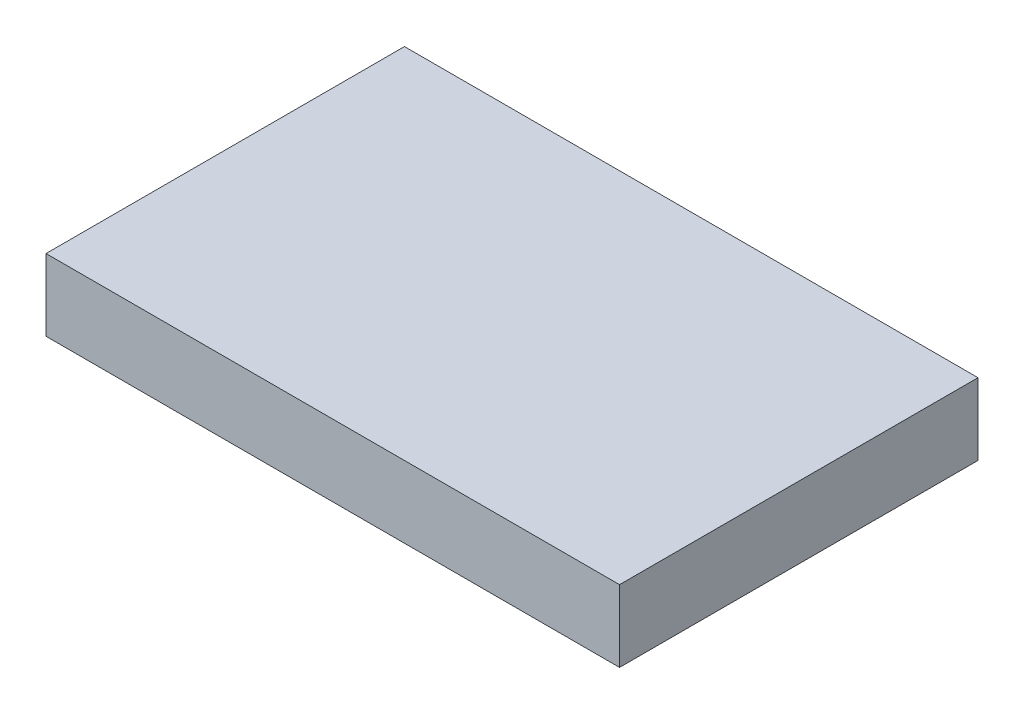
ISO-10303-21;
HEADER;
FILE_DESCRIPTION(('STEP AP214'),'2;1');
FILE_NAME('part.step','',(''),(''),'','','');
FILE_SCHEMA(('AUTOMOTIVE_DESIGN { 1 0 10303 214 1 1 1 1 }'));
ENDSEC;
DATA;
#1=APPLICATION_CONTEXT('core data for automotive mechanical design processes');
#2=APPLICATION_PROTOCOL_DEFINITION('international standard','automotive_design',2000,#1);
#3=PRODUCT_CONTEXT('',#1,'mechanical');
#4=PRODUCT('Part','Part','',(#3));
#5=PRODUCT_RELATED_PRODUCT_CATEGORY('part','',(#4));
#6=PRODUCT_DEFINITION_FORMATION('','',#4);
#7=PRODUCT_DEFINITION_CONTEXT('part definition',#1,'design');
#8=PRODUCT_DEFINITION('design','',#6,#7);
#9=PRODUCT_DEFINITION_SHAPE('','',#8);
#10=(LENGTH_UNIT() NAMED_UNIT(*) SI_UNIT(.MILLI.,.METRE.));
#11=(NAMED_UNIT(*) PLANE_ANGLE_UNIT() SI_UNIT($,.RADIAN.));
#12=(NAMED_UNIT(*) SI_UNIT($,.STERADIAN.) SOLID_ANGLE_UNIT());
#13=UNCERTAINTY_MEASURE_WITH_UNIT(LENGTH_MEASURE(1.E-05),#10,'distance_accuracy_value','');
#14=(GEOMETRIC_REPRESENTATION_CONTEXT(3) GLOBAL_UNCERTAINTY_ASSIGNED_CONTEXT((#13)) GLOBAL_UNIT_ASSIGNED_CONTEXT((#10,
#11,#12)) REPRESENTATION_CONTEXT('',''));
#15=CARTESIAN_POINT('',(0.,0.,0.));
#16=DIRECTION('',(0.,0.,1.));
#17=DIRECTION('',(1.,0.,0.));
#18=AXIS2_PLACEMENT_3D('',#15,#16,#17);
#19=CARTESIAN_POINT('',(0.,5.,0.));
#20=DIRECTION('',(0.,0.,-1.));
#21=DIRECTION('',(-1.,0.,0.));
#22=AXIS2_PLACEMENT_3D('',#19,#20,#21);
#23=PLANE('',#22);
#24=DIRECTION('',(1.,0.,0.));
#25=VECTOR('',#24,1.);
#26=CARTESIAN_POINT('',(0.,0.,0.));
#27=LINE('',#26,#25);
#28=CARTESIAN_POINT('',(0.,0.,0.));
#29=VERTEX_POINT('',#28);
#30=CARTESIAN_POINT('',(40.,0.,0.));
#31=VERTEX_POINT('',#30);
#32=EDGE_CURVE('E96',#29,#31,#27,.T.);
#33=ORIENTED_EDGE('',*,*,#32,.T.);
#34=DIRECTION('',(0.,-1.,0.));
#35=VECTOR('',#34,1.);
#36=CARTESIAN_POINT('',(40.,5.,0.));
#37=LINE('',#36,#35);
#38=CARTESIAN_POINT('',(40.,5.,0.));
#39=VERTEX_POINT('',#38);
#40=EDGE_CURVE('E11',#39,#31,#37,.T.);
#41=ORIENTED_EDGE('',*,*,#40,.F.);
#42=DIRECTION('',(1.,0.,0.));
#43=VECTOR('',#42,1.);
#44=CARTESIAN_POINT('',(0.,5.,0.));
#45=LINE('',#44,#43);
#46=CARTESIAN_POINT('',(0.,5.,0.));
#47=VERTEX_POINT('',#46);
#48=EDGE_CURVE('E82',#47,#39,#45,.T.);
#49=ORIENTED_EDGE('',*,*,#48,.F.);
#50=DIRECTION('',(0.,-1.,0.));
#51=VECTOR('',#50,1.);
#52=CARTESIAN_POINT('',(0.,5.,0.));
#53=LINE('',#52,#51);
#54=EDGE_CURVE('E49',#47,#29,#53,.T.);
#55=ORIENTED_EDGE('',*,*,#54,.T.);
#56=EDGE_LOOP('',(#33,#41,#49,#55));
#57=FACE_BOUND('',#56,.T.);
#58=ADVANCED_FACE('F33',(#57),#23,.F.);
#59=CARTESIAN_POINT('',(40.,5.,0.));
#60=DIRECTION('',(-1.,0.,0.));
#61=DIRECTION('',(0.,0.,1.));
#62=AXIS2_PLACEMENT_3D('',#59,#60,#61);
#63=PLANE('',#62);
#64=DIRECTION('',(0.,0.,-1.));
#65=VECTOR('',#64,1.);
#66=CARTESIAN_POINT('',(40.,0.,0.));
#67=LINE('',#66,#65);
#68=CARTESIAN_POINT('',(40.,0.,-25.));
#69=VERTEX_POINT('',#68);
#70=EDGE_CURVE('E87',#31,#69,#67,.T.);
#71=ORIENTED_EDGE('',*,*,#70,.T.);
#72=DIRECTION('',(0.,-1.,0.));
#73=VECTOR('',#72,1.);
#74=CARTESIAN_POINT('',(40.,5.,-25.));
#75=LINE('',#74,#73);
#76=CARTESIAN_POINT('',(40.,5.,-25.));
#77=VERTEX_POINT('',#76);
#78=EDGE_CURVE('E41',#77,#69,#75,.T.);
#79=ORIENTED_EDGE('',*,*,#78,.F.);
#80=DIRECTION('',(0.,0.,-1.));
#81=VECTOR('',#80,1.);
#82=CARTESIAN_POINT('',(40.,5.,0.));
#83=LINE('',#82,#81);
#84=EDGE_CURVE('E74',#39,#77,#83,.T.);
#85=ORIENTED_EDGE('',*,*,#84,.F.);
#86=ORIENTED_EDGE('',*,*,#40,.T.);
#87=EDGE_LOOP('',(#71,#79,#85,#86));
#88=FACE_BOUND('',#87,.T.);
#89=ADVANCED_FACE('F86',(#88),#63,.F.);
#90=CARTESIAN_POINT('',(0.,5.,-25.));
#91=DIRECTION('',(0.,0.,-1.));
#92=DIRECTION('',(-1.,0.,0.));
#93=AXIS2_PLACEMENT_3D('',#90,#91,#92);
#94=PLANE('',#93);
#95=DIRECTION('',(1.,0.,0.));
#96=VECTOR('',#95,1.);
#97=CARTESIAN_POINT('',(0.,0.,-25.));
#98=LINE('',#97,#96);
#99=CARTESIAN_POINT('',(0.,0.,-25.));
#100=VERTEX_POINT('',#99);
#101=EDGE_CURVE('E99',#100,#69,#98,.T.);
#102=ORIENTED_EDGE('',*,*,#101,.F.);
#103=DIRECTION('',(0.,-1.,0.));
#104=VECTOR('',#103,1.);
#105=CARTESIAN_POINT('',(0.,5.,-25.));
#106=LINE('',#105,#104);
#107=CARTESIAN_POINT('',(0.,5.,-25.));
#108=VERTEX_POINT('',#107);
#109=EDGE_CURVE('E63',#108,#100,#106,.T.);
#110=ORIENTED_EDGE('',*,*,#109,.F.);
#111=DIRECTION('',(1.,0.,0.));
#112=VECTOR('',#111,1.);
#113=CARTESIAN_POINT('',(0.,5.,-25.));
#114=LINE('',#113,#112);
#115=EDGE_CURVE('E81',#108,#77,#114,.T.);
#116=ORIENTED_EDGE('',*,*,#115,.T.);
#117=ORIENTED_EDGE('',*,*,#78,.T.);
#118=EDGE_LOOP('',(#102,#110,#116,#117));
#119=FACE_BOUND('',#118,.T.);
#120=ADVANCED_FACE('F90',(#119),#94,.T.);
#121=CARTESIAN_POINT('',(0.,5.,0.));
#122=DIRECTION('',(-1.,0.,0.));
#123=DIRECTION('',(0.,0.,1.));
#124=AXIS2_PLACEMENT_3D('',#121,#122,#123);
#125=PLANE('',#124);
#126=DIRECTION('',(0.,0.,-1.));
#127=VECTOR('',#126,1.);
#128=CARTESIAN_POINT('',(0.,0.,0.));
#129=LINE('',#128,#127);
#130=EDGE_CURVE('E101',#29,#100,#129,.T.);
#131=ORIENTED_EDGE('',*,*,#130,.F.);
#132=ORIENTED_EDGE('',*,*,#54,.F.);
#133=DIRECTION('',(0.,0.,-1.));
#134=VECTOR('',#133,1.);
#135=CARTESIAN_POINT('',(0.,5.,0.));
#136=LINE('',#135,#134);
#137=EDGE_CURVE('E91',#47,#108,#136,.T.);
#138=ORIENTED_EDGE('',*,*,#137,.T.);
#139=ORIENTED_EDGE('',*,*,#109,.T.);
#140=EDGE_LOOP('',(#131,#132,#138,#139));
#141=FACE_BOUND('',#140,.T.);
#142=ADVANCED_FACE('F107',(#141),#125,.T.);
#143=CARTESIAN_POINT('',(0.,5.,0.));
#144=DIRECTION('',(0.,1.,0.));
#145=DIRECTION('',(0.,0.,1.));
#146=AXIS2_PLACEMENT_3D('',#143,#144,#145);
#147=PLANE('',#146);
#148=ORIENTED_EDGE('',*,*,#48,.T.);
#149=ORIENTED_EDGE('',*,*,#84,.T.);
#150=ORIENTED_EDGE('',*,*,#115,.F.);
#151=ORIENTED_EDGE('',*,*,#137,.F.);
#152=EDGE_LOOP('',(#148,#149,#150,#151));
#153=FACE_BOUND('',#152,.T.);
#154=ADVANCED_FACE('F78',(#153),#147,.T.);
#155=CARTESIAN_POINT('',(0.,0.,0.));
#156=DIRECTION('',(0.,1.,0.));
#157=DIRECTION('',(0.,0.,1.));
#158=AXIS2_PLACEMENT_3D('',#155,#156,#157);
#159=PLANE('',#158);
#160=ORIENTED_EDGE('',*,*,#32,.F.);
#161=ORIENTED_EDGE('',*,*,#130,.T.);
#162=ORIENTED_EDGE('',*,*,#101,.T.);
#163=ORIENTED_EDGE('',*,*,#70,.F.);
#164=EDGE_LOOP('',(#160,#161,#162,#163));
#165=FACE_BOUND('',#164,.T.);
#166=ADVANCED_FACE('F106',(#165),#159,.F.);
#167=CLOSED_SHELL('',(#58,#89,#120,#142,#154,#166));
#168=MANIFOLD_SOLID_BREP('B2',#167);
#169=ADVANCED_BREP_SHAPE_REPRESENTATION('',(#18,#168),#14);
#170=SHAPE_DEFINITION_REPRESENTATION(#9,#169);
ENDSEC;
END-ISO-10303-21;
